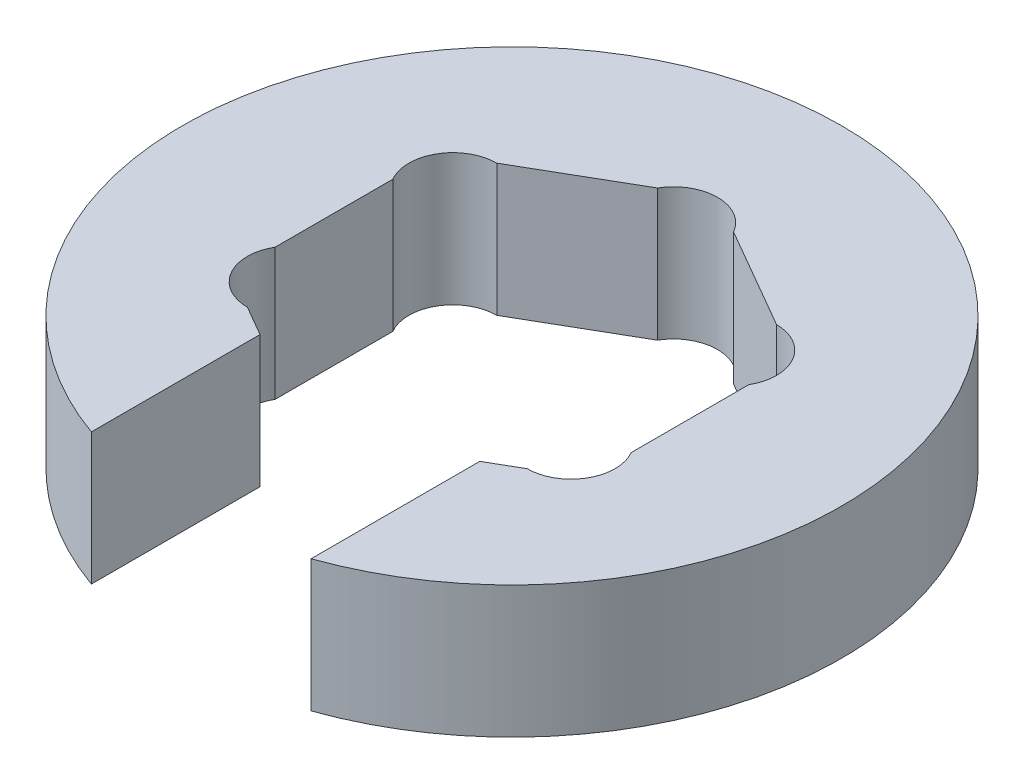
ISO-10303-21;
HEADER;
FILE_DESCRIPTION(('STEP AP214'),'2;1');
FILE_NAME('part.step','',(''),(''),'','','');
FILE_SCHEMA(('AUTOMOTIVE_DESIGN { 1 0 10303 214 1 1 1 1 }'));
ENDSEC;
DATA;
#1=APPLICATION_CONTEXT('core data for automotive mechanical design processes');
#2=APPLICATION_PROTOCOL_DEFINITION('international standard','automotive_design',2000,#1);
#3=PRODUCT_CONTEXT('',#1,'mechanical');
#4=PRODUCT('Part','Part','',(#3));
#5=PRODUCT_RELATED_PRODUCT_CATEGORY('part','',(#4));
#6=PRODUCT_DEFINITION_FORMATION('','',#4);
#7=PRODUCT_DEFINITION_CONTEXT('part definition',#1,'design');
#8=PRODUCT_DEFINITION('design','',#6,#7);
#9=PRODUCT_DEFINITION_SHAPE('','',#8);
#10=(LENGTH_UNIT() NAMED_UNIT(*) SI_UNIT(.MILLI.,.METRE.));
#11=(NAMED_UNIT(*) PLANE_ANGLE_UNIT() SI_UNIT($,.RADIAN.));
#12=(NAMED_UNIT(*) SI_UNIT($,.STERADIAN.) SOLID_ANGLE_UNIT());
#13=UNCERTAINTY_MEASURE_WITH_UNIT(LENGTH_MEASURE(1.E-05),#10,'distance_accuracy_value','');
#14=(GEOMETRIC_REPRESENTATION_CONTEXT(3) GLOBAL_UNCERTAINTY_ASSIGNED_CONTEXT((#13)) GLOBAL_UNIT_ASSIGNED_CONTEXT((#10,
#11,#12)) REPRESENTATION_CONTEXT('',''));
#15=CARTESIAN_POINT('',(0.,0.,0.));
#16=DIRECTION('',(0.,0.,1.));
#17=DIRECTION('',(1.,0.,0.));
#18=AXIS2_PLACEMENT_3D('',#15,#16,#17);
#19=CARTESIAN_POINT('',(0.,3.,0.));
#20=DIRECTION('',(0.,-1.,0.));
#21=DIRECTION('',(0.,0.,-1.));
#22=AXIS2_PLACEMENT_3D('',#19,#20,#21);
#23=CYLINDRICAL_SURFACE('',#22,7.5);
#24=CARTESIAN_POINT('',(0.,0.,0.));
#25=DIRECTION('',(0.,1.,0.));
#26=DIRECTION('',(0.,0.,1.));
#27=AXIS2_PLACEMENT_3D('',#24,#25,#26);
#28=CIRCLE('',#27,7.5);
#29=CARTESIAN_POINT('',(2.5,0.,7.07106781186547));
#30=VERTEX_POINT('',#29);
#31=CARTESIAN_POINT('',(-2.5,0.,7.07106781186547));
#32=VERTEX_POINT('',#31);
#33=EDGE_CURVE('E154',#30,#32,#28,.T.);
#34=ORIENTED_EDGE('',*,*,#33,.T.);
#35=DIRECTION('',(0.,-1.,0.));
#36=VECTOR('',#35,1.);
#37=CARTESIAN_POINT('',(-2.5,3.,7.07106781186547));
#38=LINE('',#37,#36);
#39=CARTESIAN_POINT('',(-2.5,3.,7.07106781186547));
#40=VERTEX_POINT('',#39);
#41=EDGE_CURVE('E152',#32,#40,#38,.F.);
#42=ORIENTED_EDGE('',*,*,#41,.T.);
#43=CARTESIAN_POINT('',(0.,3.,0.));
#44=DIRECTION('',(0.,1.,0.));
#45=DIRECTION('',(0.,0.,1.));
#46=AXIS2_PLACEMENT_3D('',#43,#44,#45);
#47=CIRCLE('',#46,7.5);
#48=CARTESIAN_POINT('',(2.5,3.,7.07106781186547));
#49=VERTEX_POINT('',#48);
#50=EDGE_CURVE('E146',#49,#40,#47,.T.);
#51=ORIENTED_EDGE('',*,*,#50,.F.);
#52=DIRECTION('',(0.,-1.,0.));
#53=VECTOR('',#52,1.);
#54=CARTESIAN_POINT('',(2.5,3.,7.07106781186547));
#55=LINE('',#54,#53);
#56=EDGE_CURVE('E131',#49,#30,#55,.T.);
#57=ORIENTED_EDGE('',*,*,#56,.T.);
#58=EDGE_LOOP('',(#34,#42,#51,#57));
#59=FACE_BOUND('',#58,.T.);
#60=ADVANCED_FACE('F34',(#59),#23,.T.);
#61=CARTESIAN_POINT('',(0.,3.,0.));
#62=DIRECTION('',(0.,1.,0.));
#63=DIRECTION('',(0.,0.,1.));
#64=AXIS2_PLACEMENT_3D('',#61,#62,#63);
#65=PLANE('',#64);
#66=DIRECTION('',(0.,0.,1.));
#67=VECTOR('',#66,1.);
#68=CARTESIAN_POINT('',(-2.5,3.,8.06549687173144));
#69=LINE('',#68,#67);
#70=CARTESIAN_POINT('',(-2.5,3.,3.2331615074619));
#71=VERTEX_POINT('',#70);
#72=EDGE_CURVE('E149',#71,#40,#69,.T.);
#73=ORIENTED_EDGE('',*,*,#72,.F.);
#74=DIRECTION('',(0.866025403784439,0.,0.5));
#75=VECTOR('',#74,1.);
#76=CARTESIAN_POINT('',(-4.05,3.,2.33826859021798));
#77=LINE('',#76,#75);
#78=CARTESIAN_POINT('',(-3.18397459621561,3.,2.83826859021796));
#79=VERTEX_POINT('',#78);
#80=EDGE_CURVE('E193',#79,#71,#77,.T.);
#81=ORIENTED_EDGE('',*,*,#80,.F.);
#82=CARTESIAN_POINT('',(-3.18397459621558,3.,1.83826859021796));
#83=DIRECTION('',(0.,1.,0.));
#84=DIRECTION('',(0.866025403784443,0.,-0.499999999999992));
#85=AXIS2_PLACEMENT_3D('',#82,#83,#84);
#86=CIRCLE('',#85,1.);
#87=CARTESIAN_POINT('',(-4.05,3.,1.33826859021793));
#88=VERTEX_POINT('',#87);
#89=EDGE_CURVE('E204',#88,#79,#86,.T.);
#90=ORIENTED_EDGE('',*,*,#89,.F.);
#91=DIRECTION('',(0.,0.,1.));
#92=VECTOR('',#91,1.);
#93=CARTESIAN_POINT('',(-4.05,3.,-2.33826859021799));
#94=LINE('',#93,#92);
#95=CARTESIAN_POINT('',(-4.05,3.,-1.33826859021806));
#96=VERTEX_POINT('',#95);
#97=EDGE_CURVE('E241',#96,#88,#94,.T.);
#98=ORIENTED_EDGE('',*,*,#97,.F.);
#99=CARTESIAN_POINT('',(-3.18397459621554,3.,-1.83826859021802));
#100=DIRECTION('',(0.,1.,0.));
#101=DIRECTION('',(0.866025403784433,0.,0.50000000000001));
#102=AXIS2_PLACEMENT_3D('',#99,#100,#101);
#103=CIRCLE('',#102,1.);
#104=CARTESIAN_POINT('',(-3.1839745962155,3.,-2.83826859021802));
#105=VERTEX_POINT('',#104);
#106=EDGE_CURVE('E139',#105,#96,#103,.T.);
#107=ORIENTED_EDGE('',*,*,#106,.F.);
#108=DIRECTION('',(-0.866025403784439,0.,0.5));
#109=VECTOR('',#108,1.);
#110=CARTESIAN_POINT('',(0.,3.,-4.67653718043597));
#111=LINE('',#110,#109);
#112=CARTESIAN_POINT('',(-0.866025403784438,3.,-4.17653718043597));
#113=VERTEX_POINT('',#112);
#114=EDGE_CURVE('E238',#113,#105,#111,.T.);
#115=ORIENTED_EDGE('',*,*,#114,.F.);
#116=CARTESIAN_POINT('',(0.,3.,-3.67653718043597));
#117=DIRECTION('',(0.,1.,0.));
#118=DIRECTION('',(0.,0.,1.));
#119=AXIS2_PLACEMENT_3D('',#116,#117,#118);
#120=CIRCLE('',#119,1.);
#121=CARTESIAN_POINT('',(0.866025403784439,3.,-4.17653718043597));
#122=VERTEX_POINT('',#121);
#123=EDGE_CURVE('E224',#122,#113,#120,.T.);
#124=ORIENTED_EDGE('',*,*,#123,.F.);
#125=DIRECTION('',(-0.866025403784439,0.,-0.5));
#126=VECTOR('',#125,1.);
#127=CARTESIAN_POINT('',(4.05,3.,-2.33826859021798));
#128=LINE('',#127,#126);
#129=CARTESIAN_POINT('',(3.18397459621557,3.,-2.83826859021798));
#130=VERTEX_POINT('',#129);
#131=EDGE_CURVE('E236',#130,#122,#128,.T.);
#132=ORIENTED_EDGE('',*,*,#131,.F.);
#133=CARTESIAN_POINT('',(3.18397459621557,3.,-1.83826859021798));
#134=DIRECTION('',(0.,1.,0.));
#135=DIRECTION('',(-0.86602540378444,0.,0.499999999999998));
#136=AXIS2_PLACEMENT_3D('',#133,#134,#135);
#137=CIRCLE('',#136,1.);
#138=CARTESIAN_POINT('',(4.05,3.,-1.33826859021797));
#139=VERTEX_POINT('',#138);
#140=EDGE_CURVE('E219',#139,#130,#137,.T.);
#141=ORIENTED_EDGE('',*,*,#140,.F.);
#142=DIRECTION('',(0.,0.,-1.));
#143=VECTOR('',#142,1.);
#144=CARTESIAN_POINT('',(4.05,3.,2.33826859021798));
#145=LINE('',#144,#143);
#146=CARTESIAN_POINT('',(4.05,3.,1.33826859021801));
#147=VERTEX_POINT('',#146);
#148=EDGE_CURVE('E234',#147,#139,#145,.T.);
#149=ORIENTED_EDGE('',*,*,#148,.F.);
#150=CARTESIAN_POINT('',(3.18397459621555,3.,1.838268590218));
#151=DIRECTION('',(0.,1.,0.));
#152=DIRECTION('',(-0.866025403784436,0.,-0.500000000000004));
#153=AXIS2_PLACEMENT_3D('',#150,#151,#152);
#154=CIRCLE('',#153,1.);
#155=CARTESIAN_POINT('',(3.18397459621553,3.,2.838268590218));
#156=VERTEX_POINT('',#155);
#157=EDGE_CURVE('E206',#156,#147,#154,.T.);
#158=ORIENTED_EDGE('',*,*,#157,.F.);
#159=DIRECTION('',(0.866025403784439,0.,-0.5));
#160=VECTOR('',#159,1.);
#161=CARTESIAN_POINT('',(0.,3.,4.67653718043597));
#162=LINE('',#161,#160);
#163=CARTESIAN_POINT('',(2.5,3.,3.2331615074619));
#164=VERTEX_POINT('',#163);
#165=EDGE_CURVE('E148',#164,#156,#162,.T.);
#166=ORIENTED_EDGE('',*,*,#165,.F.);
#167=DIRECTION('',(0.,0.,-1.));
#168=VECTOR('',#167,1.);
#169=CARTESIAN_POINT('',(2.5,3.,8.06549687173144));
#170=LINE('',#169,#168);
#171=EDGE_CURVE('E48',#49,#164,#170,.T.);
#172=ORIENTED_EDGE('',*,*,#171,.F.);
#173=ORIENTED_EDGE('',*,*,#50,.T.);
#174=EDGE_LOOP('',(#73,#81,#90,#98,#107,#115,#124,#132,#141,#149,#158,#166,#172,#173));
#175=FACE_BOUND('',#174,.T.);
#176=ADVANCED_FACE('F145',(#175),#65,.T.);
#177=CARTESIAN_POINT('',(0.,0.,0.));
#178=DIRECTION('',(0.,1.,0.));
#179=DIRECTION('',(0.,0.,1.));
#180=AXIS2_PLACEMENT_3D('',#177,#178,#179);
#181=PLANE('',#180);
#182=DIRECTION('',(0.866025403784439,0.,0.5));
#183=VECTOR('',#182,1.);
#184=CARTESIAN_POINT('',(-2.025,0.,3.50740288532698));
#185=LINE('',#184,#183);
#186=CARTESIAN_POINT('',(-3.18397459621561,0.,2.83826859021795));
#187=VERTEX_POINT('',#186);
#188=CARTESIAN_POINT('',(-2.5,0.,3.2331615074619));
#189=VERTEX_POINT('',#188);
#190=EDGE_CURVE('E166',#187,#189,#185,.T.);
#191=ORIENTED_EDGE('',*,*,#190,.T.);
#192=DIRECTION('',(0.,0.,1.));
#193=VECTOR('',#192,1.);
#194=CARTESIAN_POINT('',(-2.5,0.,0.));
#195=LINE('',#194,#193);
#196=EDGE_CURVE('E55',#189,#32,#195,.T.);
#197=ORIENTED_EDGE('',*,*,#196,.T.);
#198=ORIENTED_EDGE('',*,*,#33,.F.);
#199=DIRECTION('',(0.,0.,-1.));
#200=VECTOR('',#199,1.);
#201=CARTESIAN_POINT('',(2.5,0.,0.));
#202=LINE('',#201,#200);
#203=CARTESIAN_POINT('',(2.5,0.,3.2331615074619));
#204=VERTEX_POINT('',#203);
#205=EDGE_CURVE('E134',#30,#204,#202,.T.);
#206=ORIENTED_EDGE('',*,*,#205,.T.);
#207=DIRECTION('',(0.866025403784439,0.,-0.5));
#208=VECTOR('',#207,1.);
#209=CARTESIAN_POINT('',(2.025,0.,3.50740288532698));
#210=LINE('',#209,#208);
#211=CARTESIAN_POINT('',(3.18397459621554,0.,2.838268590218));
#212=VERTEX_POINT('',#211);
#213=EDGE_CURVE('E169',#204,#212,#210,.T.);
#214=ORIENTED_EDGE('',*,*,#213,.T.);
#215=CARTESIAN_POINT('',(3.18397459621555,0.,1.838268590218));
#216=DIRECTION('',(0.,1.,0.));
#217=DIRECTION('',(0.,0.,1.));
#218=AXIS2_PLACEMENT_3D('',#215,#216,#217);
#219=CIRCLE('',#218,1.);
#220=CARTESIAN_POINT('',(4.05,0.,1.33826859021801));
#221=VERTEX_POINT('',#220);
#222=EDGE_CURVE('E213',#212,#221,#219,.T.);
#223=ORIENTED_EDGE('',*,*,#222,.T.);
#224=DIRECTION('',(0.,0.,-1.));
#225=VECTOR('',#224,1.);
#226=CARTESIAN_POINT('',(4.05,0.,0.));
#227=LINE('',#226,#225);
#228=CARTESIAN_POINT('',(4.05,0.,-1.33826859021797));
#229=VERTEX_POINT('',#228);
#230=EDGE_CURVE('E171',#221,#229,#227,.T.);
#231=ORIENTED_EDGE('',*,*,#230,.T.);
#232=CARTESIAN_POINT('',(3.18397459621557,0.,-1.83826859021798));
#233=DIRECTION('',(0.,1.,0.));
#234=DIRECTION('',(0.,0.,1.));
#235=AXIS2_PLACEMENT_3D('',#232,#233,#234);
#236=CIRCLE('',#235,1.);
#237=CARTESIAN_POINT('',(3.18397459621557,0.,-2.83826859021798));
#238=VERTEX_POINT('',#237);
#239=EDGE_CURVE('E222',#229,#238,#236,.T.);
#240=ORIENTED_EDGE('',*,*,#239,.T.);
#241=DIRECTION('',(-0.866025403784439,0.,-0.5));
#242=VECTOR('',#241,1.);
#243=CARTESIAN_POINT('',(2.025,0.,-3.50740288532698));
#244=LINE('',#243,#242);
#245=CARTESIAN_POINT('',(0.866025403784439,0.,-4.17653718043597));
#246=VERTEX_POINT('',#245);
#247=EDGE_CURVE('E153',#238,#246,#244,.T.);
#248=ORIENTED_EDGE('',*,*,#247,.T.);
#249=CARTESIAN_POINT('',(0.,0.,-3.67653718043597));
#250=DIRECTION('',(0.,1.,0.));
#251=DIRECTION('',(0.,0.,1.));
#252=AXIS2_PLACEMENT_3D('',#249,#250,#251);
#253=CIRCLE('',#252,1.);
#254=CARTESIAN_POINT('',(-0.866025403784438,0.,-4.17653718043597));
#255=VERTEX_POINT('',#254);
#256=EDGE_CURVE('E228',#246,#255,#253,.T.);
#257=ORIENTED_EDGE('',*,*,#256,.T.);
#258=DIRECTION('',(-0.866025403784439,0.,0.5));
#259=VECTOR('',#258,1.);
#260=CARTESIAN_POINT('',(-2.025,0.,-3.50740288532698));
#261=LINE('',#260,#259);
#262=CARTESIAN_POINT('',(-3.1839745962155,0.,-2.83826859021802));
#263=VERTEX_POINT('',#262);
#264=EDGE_CURVE('E156',#255,#263,#261,.T.);
#265=ORIENTED_EDGE('',*,*,#264,.T.);
#266=CARTESIAN_POINT('',(-3.18397459621554,0.,-1.83826859021802));
#267=DIRECTION('',(0.,1.,0.));
#268=DIRECTION('',(0.,0.,1.));
#269=AXIS2_PLACEMENT_3D('',#266,#267,#268);
#270=CIRCLE('',#269,1.);
#271=CARTESIAN_POINT('',(-4.05,0.,-1.33826859021806));
#272=VERTEX_POINT('',#271);
#273=EDGE_CURVE('E277',#263,#272,#270,.T.);
#274=ORIENTED_EDGE('',*,*,#273,.T.);
#275=DIRECTION('',(0.,0.,1.));
#276=VECTOR('',#275,1.);
#277=CARTESIAN_POINT('',(-4.05,0.,0.));
#278=LINE('',#277,#276);
#279=CARTESIAN_POINT('',(-4.05,0.,1.33826859021793));
#280=VERTEX_POINT('',#279);
#281=EDGE_CURVE('E164',#272,#280,#278,.T.);
#282=ORIENTED_EDGE('',*,*,#281,.T.);
#283=CARTESIAN_POINT('',(-3.18397459621558,0.,1.83826859021795));
#284=DIRECTION('',(0.,1.,0.));
#285=DIRECTION('',(0.,0.,1.));
#286=AXIS2_PLACEMENT_3D('',#283,#284,#285);
#287=CIRCLE('',#286,1.);
#288=EDGE_CURVE('E198',#280,#187,#287,.T.);
#289=ORIENTED_EDGE('',*,*,#288,.T.);
#290=EDGE_LOOP('',(#191,#197,#198,#206,#214,#223,#231,#240,#248,#257,#265,#274,#282,#289));
#291=FACE_BOUND('',#290,.T.);
#292=ADVANCED_FACE('F196',(#291),#181,.F.);
#293=CARTESIAN_POINT('',(4.05,-2.,2.33826859021798));
#294=DIRECTION('',(1.,0.,0.));
#295=DIRECTION('',(0.,0.,-1.));
#296=AXIS2_PLACEMENT_3D('',#293,#294,#295);
#297=PLANE('',#296);
#298=ORIENTED_EDGE('',*,*,#230,.F.);
#299=DIRECTION('',(0.,1.,0.));
#300=VECTOR('',#299,1.);
#301=CARTESIAN_POINT('',(4.05,-2.,1.33826859021801));
#302=LINE('',#301,#300);
#303=EDGE_CURVE('E216',#221,#147,#302,.T.);
#304=ORIENTED_EDGE('',*,*,#303,.T.);
#305=ORIENTED_EDGE('',*,*,#148,.T.);
#306=DIRECTION('',(0.,1.,0.));
#307=VECTOR('',#306,1.);
#308=CARTESIAN_POINT('',(4.05,-2.,-1.33826859021797));
#309=LINE('',#308,#307);
#310=EDGE_CURVE('E221',#139,#229,#309,.F.);
#311=ORIENTED_EDGE('',*,*,#310,.T.);
#312=EDGE_LOOP('',(#298,#304,#305,#311));
#313=FACE_BOUND('',#312,.T.);
#314=ADVANCED_FACE('F254',(#313),#297,.F.);
#315=CARTESIAN_POINT('',(0.,-2.,4.67653718043597));
#316=DIRECTION('',(0.5,0.,0.866025403784439));
#317=DIRECTION('',(0.866025403784439,0.,-0.5));
#318=AXIS2_PLACEMENT_3D('',#315,#316,#317);
#319=PLANE('',#318);
#320=ORIENTED_EDGE('',*,*,#213,.F.);
#321=DIRECTION('',(0.,1.,0.));
#322=VECTOR('',#321,1.);
#323=CARTESIAN_POINT('',(2.5,-2.,3.2331615074619));
#324=LINE('',#323,#322);
#325=EDGE_CURVE('E11',#204,#164,#324,.T.);
#326=ORIENTED_EDGE('',*,*,#325,.T.);
#327=ORIENTED_EDGE('',*,*,#165,.T.);
#328=DIRECTION('',(0.,1.,0.));
#329=VECTOR('',#328,1.);
#330=CARTESIAN_POINT('',(3.18397459621554,-2.,2.838268590218));
#331=LINE('',#330,#329);
#332=EDGE_CURVE('E179',#156,#212,#331,.F.);
#333=ORIENTED_EDGE('',*,*,#332,.T.);
#334=EDGE_LOOP('',(#320,#326,#327,#333));
#335=FACE_BOUND('',#334,.T.);
#336=ADVANCED_FACE('F244',(#335),#319,.F.);
#337=CARTESIAN_POINT('',(-4.05,-2.,2.33826859021798));
#338=DIRECTION('',(-0.5,0.,0.866025403784439));
#339=DIRECTION('',(0.866025403784439,0.,0.5));
#340=AXIS2_PLACEMENT_3D('',#337,#338,#339);
#341=PLANE('',#340);
#342=ORIENTED_EDGE('',*,*,#80,.T.);
#343=DIRECTION('',(0.,-1.,0.));
#344=VECTOR('',#343,1.);
#345=CARTESIAN_POINT('',(-2.5,-2.,3.2331615074619));
#346=LINE('',#345,#344);
#347=EDGE_CURVE('E41',#71,#189,#346,.T.);
#348=ORIENTED_EDGE('',*,*,#347,.T.);
#349=ORIENTED_EDGE('',*,*,#190,.F.);
#350=DIRECTION('',(0.,1.,0.));
#351=VECTOR('',#350,1.);
#352=CARTESIAN_POINT('',(-3.18397459621561,-2.,2.83826859021795));
#353=LINE('',#352,#351);
#354=EDGE_CURVE('E203',#187,#79,#353,.T.);
#355=ORIENTED_EDGE('',*,*,#354,.T.);
#356=EDGE_LOOP('',(#342,#348,#349,#355));
#357=FACE_BOUND('',#356,.T.);
#358=ADVANCED_FACE('F190',(#357),#341,.F.);
#359=CARTESIAN_POINT('',(-4.05,-2.,-2.33826859021799));
#360=DIRECTION('',(-1.,0.,0.));
#361=DIRECTION('',(0.,0.,1.));
#362=AXIS2_PLACEMENT_3D('',#359,#360,#361);
#363=PLANE('',#362);
#364=ORIENTED_EDGE('',*,*,#281,.F.);
#365=DIRECTION('',(0.,1.,0.));
#366=VECTOR('',#365,1.);
#367=CARTESIAN_POINT('',(-4.05,-2.,-1.33826859021806));
#368=LINE('',#367,#366);
#369=EDGE_CURVE('E208',#272,#96,#368,.T.);
#370=ORIENTED_EDGE('',*,*,#369,.T.);
#371=ORIENTED_EDGE('',*,*,#97,.T.);
#372=DIRECTION('',(0.,1.,0.));
#373=VECTOR('',#372,1.);
#374=CARTESIAN_POINT('',(-4.05,-2.,1.33826859021793));
#375=LINE('',#374,#373);
#376=EDGE_CURVE('E182',#88,#280,#375,.F.);
#377=ORIENTED_EDGE('',*,*,#376,.T.);
#378=EDGE_LOOP('',(#364,#370,#371,#377));
#379=FACE_BOUND('',#378,.T.);
#380=ADVANCED_FACE('F282',(#379),#363,.F.);
#381=CARTESIAN_POINT('',(0.,-2.,-4.67653718043597));
#382=DIRECTION('',(-0.5,0.,-0.866025403784439));
#383=DIRECTION('',(-0.866025403784439,0.,0.5));
#384=AXIS2_PLACEMENT_3D('',#381,#382,#383);
#385=PLANE('',#384);
#386=ORIENTED_EDGE('',*,*,#114,.T.);
#387=DIRECTION('',(0.,1.,0.));
#388=VECTOR('',#387,1.);
#389=CARTESIAN_POINT('',(-3.1839745962155,-2.,-2.83826859021802));
#390=LINE('',#389,#388);
#391=EDGE_CURVE('E185',#105,#263,#390,.F.);
#392=ORIENTED_EDGE('',*,*,#391,.T.);
#393=ORIENTED_EDGE('',*,*,#264,.F.);
#394=DIRECTION('',(0.,1.,0.));
#395=VECTOR('',#394,1.);
#396=CARTESIAN_POINT('',(-0.866025403784438,-2.,-4.17653718043597));
#397=LINE('',#396,#395);
#398=EDGE_CURVE('E231',#255,#113,#397,.T.);
#399=ORIENTED_EDGE('',*,*,#398,.T.);
#400=EDGE_LOOP('',(#386,#392,#393,#399));
#401=FACE_BOUND('',#400,.T.);
#402=ADVANCED_FACE('F271',(#401),#385,.F.);
#403=CARTESIAN_POINT('',(4.05,-2.,-2.33826859021798));
#404=DIRECTION('',(0.5,0.,-0.866025403784439));
#405=DIRECTION('',(-0.866025403784439,0.,-0.5));
#406=AXIS2_PLACEMENT_3D('',#403,#404,#405);
#407=PLANE('',#406);
#408=ORIENTED_EDGE('',*,*,#247,.F.);
#409=DIRECTION('',(0.,1.,0.));
#410=VECTOR('',#409,1.);
#411=CARTESIAN_POINT('',(3.18397459621557,-2.,-2.83826859021798));
#412=LINE('',#411,#410);
#413=EDGE_CURVE('E176',#238,#130,#412,.T.);
#414=ORIENTED_EDGE('',*,*,#413,.T.);
#415=ORIENTED_EDGE('',*,*,#131,.T.);
#416=DIRECTION('',(0.,1.,0.));
#417=VECTOR('',#416,1.);
#418=CARTESIAN_POINT('',(0.866025403784439,-2.,-4.17653718043597));
#419=LINE('',#418,#417);
#420=EDGE_CURVE('E173',#122,#246,#419,.F.);
#421=ORIENTED_EDGE('',*,*,#420,.T.);
#422=EDGE_LOOP('',(#408,#414,#415,#421));
#423=FACE_BOUND('',#422,.T.);
#424=ADVANCED_FACE('F265',(#423),#407,.F.);
#425=CARTESIAN_POINT('',(0.,-2.,-3.67653718043597));
#426=DIRECTION('',(0.,1.,0.));
#427=DIRECTION('',(0.,0.,1.));
#428=AXIS2_PLACEMENT_3D('',#425,#426,#427);
#429=CYLINDRICAL_SURFACE('',#428,1.);
#430=ORIENTED_EDGE('',*,*,#256,.F.);
#431=ORIENTED_EDGE('',*,*,#420,.F.);
#432=ORIENTED_EDGE('',*,*,#123,.T.);
#433=ORIENTED_EDGE('',*,*,#398,.F.);
#434=EDGE_LOOP('',(#430,#431,#432,#433));
#435=FACE_BOUND('',#434,.T.);
#436=ADVANCED_FACE('F269',(#435),#429,.F.);
#437=CARTESIAN_POINT('',(3.18397459621557,-2.,-1.83826859021798));
#438=DIRECTION('',(0.,1.,0.));
#439=DIRECTION('',(-1.,0.,0.));
#440=AXIS2_PLACEMENT_3D('',#437,#438,#439);
#441=CYLINDRICAL_SURFACE('',#440,1.);
#442=ORIENTED_EDGE('',*,*,#310,.F.);
#443=ORIENTED_EDGE('',*,*,#140,.T.);
#444=ORIENTED_EDGE('',*,*,#413,.F.);
#445=ORIENTED_EDGE('',*,*,#239,.F.);
#446=EDGE_LOOP('',(#442,#443,#444,#445));
#447=FACE_BOUND('',#446,.T.);
#448=ADVANCED_FACE('F257',(#447),#441,.F.);
#449=CARTESIAN_POINT('',(3.18397459621555,-2.,1.838268590218));
#450=DIRECTION('',(0.,1.,0.));
#451=DIRECTION('',(0.,0.,1.));
#452=AXIS2_PLACEMENT_3D('',#449,#450,#451);
#453=CYLINDRICAL_SURFACE('',#452,1.);
#454=ORIENTED_EDGE('',*,*,#222,.F.);
#455=ORIENTED_EDGE('',*,*,#332,.F.);
#456=ORIENTED_EDGE('',*,*,#157,.T.);
#457=ORIENTED_EDGE('',*,*,#303,.F.);
#458=EDGE_LOOP('',(#454,#455,#456,#457));
#459=FACE_BOUND('',#458,.T.);
#460=ADVANCED_FACE('F250',(#459),#453,.F.);
#461=CARTESIAN_POINT('',(-3.18397459621558,-2.,1.83826859021795));
#462=DIRECTION('',(0.,1.,0.));
#463=DIRECTION('',(0.,0.,1.));
#464=AXIS2_PLACEMENT_3D('',#461,#462,#463);
#465=CYLINDRICAL_SURFACE('',#464,1.);
#466=ORIENTED_EDGE('',*,*,#288,.F.);
#467=ORIENTED_EDGE('',*,*,#376,.F.);
#468=ORIENTED_EDGE('',*,*,#89,.T.);
#469=ORIENTED_EDGE('',*,*,#354,.F.);
#470=EDGE_LOOP('',(#466,#467,#468,#469));
#471=FACE_BOUND('',#470,.T.);
#472=ADVANCED_FACE('F283',(#471),#465,.F.);
#473=CARTESIAN_POINT('',(-3.18397459621554,-2.,-1.83826859021802));
#474=DIRECTION('',(0.,1.,0.));
#475=DIRECTION('',(-1.,0.,0.));
#476=AXIS2_PLACEMENT_3D('',#473,#474,#475);
#477=CYLINDRICAL_SURFACE('',#476,1.);
#478=ORIENTED_EDGE('',*,*,#273,.F.);
#479=ORIENTED_EDGE('',*,*,#391,.F.);
#480=ORIENTED_EDGE('',*,*,#106,.T.);
#481=ORIENTED_EDGE('',*,*,#369,.F.);
#482=EDGE_LOOP('',(#478,#479,#480,#481));
#483=FACE_BOUND('',#482,.T.);
#484=ADVANCED_FACE('F279',(#483),#477,.F.);
#485=CARTESIAN_POINT('',(-2.5,-7.,8.06549687173144));
#486=DIRECTION('',(-1.,0.,0.));
#487=DIRECTION('',(0.,0.,1.));
#488=AXIS2_PLACEMENT_3D('',#485,#486,#487);
#489=PLANE('',#488);
#490=ORIENTED_EDGE('',*,*,#196,.F.);
#491=ORIENTED_EDGE('',*,*,#347,.F.);
#492=ORIENTED_EDGE('',*,*,#72,.T.);
#493=ORIENTED_EDGE('',*,*,#41,.F.);
#494=EDGE_LOOP('',(#490,#491,#492,#493));
#495=FACE_BOUND('',#494,.T.);
#496=ADVANCED_FACE('F288',(#495),#489,.F.);
#497=CARTESIAN_POINT('',(2.5,-7.,8.06549687173144));
#498=DIRECTION('',(1.,0.,0.));
#499=DIRECTION('',(0.,0.,-1.));
#500=AXIS2_PLACEMENT_3D('',#497,#498,#499);
#501=PLANE('',#500);
#502=ORIENTED_EDGE('',*,*,#171,.T.);
#503=ORIENTED_EDGE('',*,*,#325,.F.);
#504=ORIENTED_EDGE('',*,*,#205,.F.);
#505=ORIENTED_EDGE('',*,*,#56,.F.);
#506=EDGE_LOOP('',(#502,#503,#504,#505));
#507=FACE_BOUND('',#506,.T.);
#508=ADVANCED_FACE('F132',(#507),#501,.F.);
#509=CLOSED_SHELL('',(#60,#176,#292,#314,#336,#358,#380,#402,#424,#436,#448,#460,#472,#484,#496,#508));
#510=MANIFOLD_SOLID_BREP('B2',#509);
#511=ADVANCED_BREP_SHAPE_REPRESENTATION('',(#18,#510),#14);
#512=SHAPE_DEFINITION_REPRESENTATION(#9,#511);
ENDSEC;
END-ISO-10303-21;
